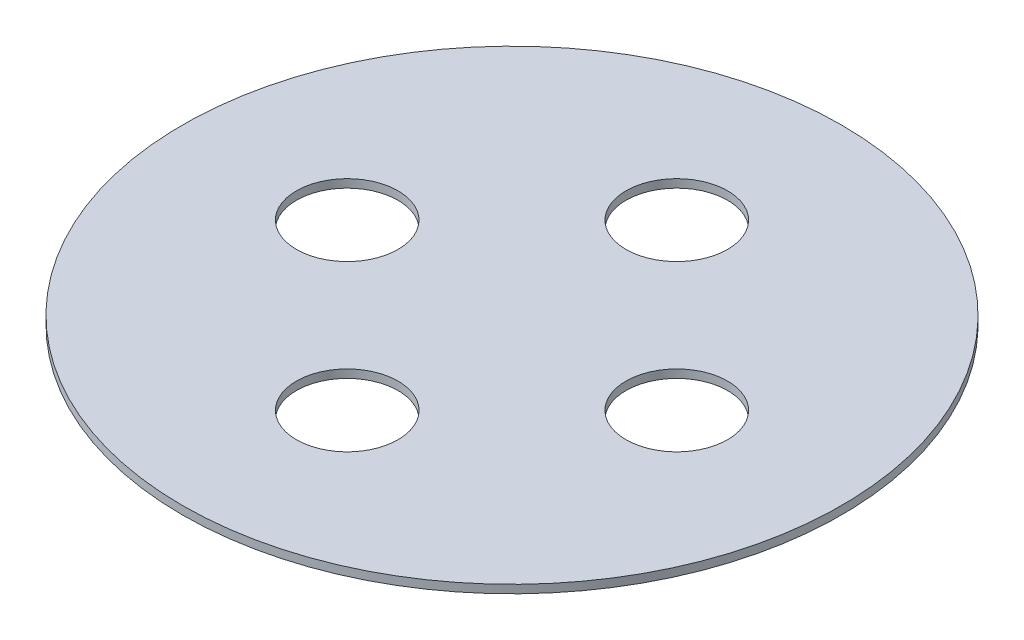
ISO-10303-21;
HEADER;
FILE_DESCRIPTION(('STEP AP214'),'2;1');
FILE_NAME('part.step','',(''),(''),'','','');
FILE_SCHEMA(('AUTOMOTIVE_DESIGN { 1 0 10303 214 1 1 1 1 }'));
ENDSEC;
DATA;
#1=APPLICATION_CONTEXT('core data for automotive mechanical design processes');
#2=APPLICATION_PROTOCOL_DEFINITION('international standard','automotive_design',2000,#1);
#3=PRODUCT_CONTEXT('',#1,'mechanical');
#4=PRODUCT('Part','Part','',(#3));
#5=PRODUCT_RELATED_PRODUCT_CATEGORY('part','',(#4));
#6=PRODUCT_DEFINITION_FORMATION('','',#4);
#7=PRODUCT_DEFINITION_CONTEXT('part definition',#1,'design');
#8=PRODUCT_DEFINITION('design','',#6,#7);
#9=PRODUCT_DEFINITION_SHAPE('','',#8);
#10=(LENGTH_UNIT() NAMED_UNIT(*) SI_UNIT(.MILLI.,.METRE.));
#11=(NAMED_UNIT(*) PLANE_ANGLE_UNIT() SI_UNIT($,.RADIAN.));
#12=(NAMED_UNIT(*) SI_UNIT($,.STERADIAN.) SOLID_ANGLE_UNIT());
#13=UNCERTAINTY_MEASURE_WITH_UNIT(LENGTH_MEASURE(1.E-05),#10,'distance_accuracy_value','');
#14=(GEOMETRIC_REPRESENTATION_CONTEXT(3) GLOBAL_UNCERTAINTY_ASSIGNED_CONTEXT((#13)) GLOBAL_UNIT_ASSIGNED_CONTEXT((#10,
#11,#12)) REPRESENTATION_CONTEXT('',''));
#15=CARTESIAN_POINT('',(0.,0.,0.));
#16=DIRECTION('',(0.,0.,1.));
#17=DIRECTION('',(1.,0.,0.));
#18=AXIS2_PLACEMENT_3D('',#15,#16,#17);
#19=CARTESIAN_POINT('',(6.,7.,0.));
#20=DIRECTION('',(0.,-1.,0.));
#21=DIRECTION('',(0.,0.,-1.));
#22=AXIS2_PLACEMENT_3D('',#19,#20,#21);
#23=CYLINDRICAL_SURFACE('',#22,1.85);
#24=CARTESIAN_POINT('',(6.,0.,0.));
#25=DIRECTION('',(0.,1.,0.));
#26=DIRECTION('',(0.,0.,1.));
#27=AXIS2_PLACEMENT_3D('',#24,#25,#26);
#28=CIRCLE('',#27,1.85);
#29=CARTESIAN_POINT('',(6.,0.,1.85));
#30=VERTEX_POINT('',#29);
#31=EDGE_CURVE('E11',#30,#30,#28,.T.);
#32=ORIENTED_EDGE('',*,*,#31,.F.);
#33=EDGE_LOOP('',(#32));
#34=FACE_BOUND('',#33,.T.);
#35=CARTESIAN_POINT('',(6.,0.3,0.));
#36=DIRECTION('',(0.,1.,0.));
#37=DIRECTION('',(0.,0.,1.));
#38=AXIS2_PLACEMENT_3D('',#35,#36,#37);
#39=CIRCLE('',#38,1.85);
#40=CARTESIAN_POINT('',(6.,0.3,1.85));
#41=VERTEX_POINT('',#40);
#42=EDGE_CURVE('E57',#41,#41,#39,.T.);
#43=ORIENTED_EDGE('',*,*,#42,.T.);
#44=EDGE_LOOP('',(#43));
#45=FACE_BOUND('',#44,.T.);
#46=ADVANCED_FACE('F37',(#34,#45),#23,.F.);
#47=CARTESIAN_POINT('',(0.,7.,6.));
#48=DIRECTION('',(0.,-1.,0.));
#49=DIRECTION('',(0.,0.,-1.));
#50=AXIS2_PLACEMENT_3D('',#47,#48,#49);
#51=CYLINDRICAL_SURFACE('',#50,1.85);
#52=CARTESIAN_POINT('',(0.,0.,6.));
#53=DIRECTION('',(0.,1.,0.));
#54=DIRECTION('',(0.,0.,1.));
#55=AXIS2_PLACEMENT_3D('',#52,#53,#54);
#56=CIRCLE('',#55,1.85);
#57=CARTESIAN_POINT('',(0.,0.,7.85));
#58=VERTEX_POINT('',#57);
#59=EDGE_CURVE('E45',#58,#58,#56,.T.);
#60=ORIENTED_EDGE('',*,*,#59,.F.);
#61=EDGE_LOOP('',(#60));
#62=FACE_BOUND('',#61,.T.);
#63=CARTESIAN_POINT('',(0.,0.3,6.));
#64=DIRECTION('',(0.,1.,0.));
#65=DIRECTION('',(0.,0.,1.));
#66=AXIS2_PLACEMENT_3D('',#63,#64,#65);
#67=CIRCLE('',#66,1.85);
#68=CARTESIAN_POINT('',(0.,0.3,7.85));
#69=VERTEX_POINT('',#68);
#70=EDGE_CURVE('E60',#69,#69,#67,.T.);
#71=ORIENTED_EDGE('',*,*,#70,.T.);
#72=EDGE_LOOP('',(#71));
#73=FACE_BOUND('',#72,.T.);
#74=ADVANCED_FACE('F96',(#62,#73),#51,.F.);
#75=CARTESIAN_POINT('',(-6.,7.,0.));
#76=DIRECTION('',(0.,-1.,0.));
#77=DIRECTION('',(0.,0.,-1.));
#78=AXIS2_PLACEMENT_3D('',#75,#76,#77);
#79=CYLINDRICAL_SURFACE('',#78,1.85);
#80=CARTESIAN_POINT('',(-6.,0.,0.));
#81=DIRECTION('',(0.,1.,0.));
#82=DIRECTION('',(0.,0.,1.));
#83=AXIS2_PLACEMENT_3D('',#80,#81,#82);
#84=CIRCLE('',#83,1.85);
#85=CARTESIAN_POINT('',(-6.,0.,1.85));
#86=VERTEX_POINT('',#85);
#87=EDGE_CURVE('E49',#86,#86,#84,.T.);
#88=ORIENTED_EDGE('',*,*,#87,.F.);
#89=EDGE_LOOP('',(#88));
#90=FACE_BOUND('',#89,.T.);
#91=CARTESIAN_POINT('',(-6.,0.3,0.));
#92=DIRECTION('',(0.,1.,0.));
#93=DIRECTION('',(0.,0.,1.));
#94=AXIS2_PLACEMENT_3D('',#91,#92,#93);
#95=CIRCLE('',#94,1.85);
#96=CARTESIAN_POINT('',(-6.,0.3,1.85));
#97=VERTEX_POINT('',#96);
#98=EDGE_CURVE('E63',#97,#97,#95,.T.);
#99=ORIENTED_EDGE('',*,*,#98,.T.);
#100=EDGE_LOOP('',(#99));
#101=FACE_BOUND('',#100,.T.);
#102=ADVANCED_FACE('F101',(#90,#101),#79,.F.);
#103=CARTESIAN_POINT('',(0.,7.,-6.));
#104=DIRECTION('',(0.,-1.,0.));
#105=DIRECTION('',(0.,0.,-1.));
#106=AXIS2_PLACEMENT_3D('',#103,#104,#105);
#107=CYLINDRICAL_SURFACE('',#106,1.85);
#108=CARTESIAN_POINT('',(0.,0.,-6.));
#109=DIRECTION('',(0.,1.,0.));
#110=DIRECTION('',(0.,0.,1.));
#111=AXIS2_PLACEMENT_3D('',#108,#109,#110);
#112=CIRCLE('',#111,1.85);
#113=CARTESIAN_POINT('',(0.,0.,-4.15));
#114=VERTEX_POINT('',#113);
#115=EDGE_CURVE('E54',#114,#114,#112,.T.);
#116=ORIENTED_EDGE('',*,*,#115,.F.);
#117=EDGE_LOOP('',(#116));
#118=FACE_BOUND('',#117,.T.);
#119=CARTESIAN_POINT('',(0.,0.3,-6.));
#120=DIRECTION('',(0.,1.,0.));
#121=DIRECTION('',(0.,0.,1.));
#122=AXIS2_PLACEMENT_3D('',#119,#120,#121);
#123=CIRCLE('',#122,1.85);
#124=CARTESIAN_POINT('',(0.,0.3,-4.15));
#125=VERTEX_POINT('',#124);
#126=EDGE_CURVE('E41',#125,#125,#123,.T.);
#127=ORIENTED_EDGE('',*,*,#126,.T.);
#128=EDGE_LOOP('',(#127));
#129=FACE_BOUND('',#128,.T.);
#130=ADVANCED_FACE('F76',(#118,#129),#107,.F.);
#131=CARTESIAN_POINT('',(0.,0.,0.));
#132=DIRECTION('',(0.,1.,0.));
#133=DIRECTION('',(0.,0.,1.));
#134=AXIS2_PLACEMENT_3D('',#131,#132,#133);
#135=PLANE('',#134);
#136=ORIENTED_EDGE('',*,*,#31,.T.);
#137=EDGE_LOOP('',(#136));
#138=FACE_BOUND('',#137,.T.);
#139=ORIENTED_EDGE('',*,*,#59,.T.);
#140=EDGE_LOOP('',(#139));
#141=FACE_BOUND('',#140,.T.);
#142=ORIENTED_EDGE('',*,*,#87,.T.);
#143=EDGE_LOOP('',(#142));
#144=FACE_BOUND('',#143,.T.);
#145=ORIENTED_EDGE('',*,*,#115,.T.);
#146=EDGE_LOOP('',(#145));
#147=FACE_BOUND('',#146,.T.);
#148=CARTESIAN_POINT('',(0.,0.,0.));
#149=DIRECTION('',(0.,1.,0.));
#150=DIRECTION('',(0.,0.,1.));
#151=AXIS2_PLACEMENT_3D('',#148,#149,#150);
#152=CIRCLE('',#151,12.);
#153=CARTESIAN_POINT('',(0.,0.,12.));
#154=VERTEX_POINT('',#153);
#155=EDGE_CURVE('E69',#154,#154,#152,.T.);
#156=ORIENTED_EDGE('',*,*,#155,.F.);
#157=EDGE_LOOP('',(#156));
#158=FACE_BOUND('',#157,.T.);
#159=ADVANCED_FACE('F39',(#138,#141,#144,#147,#158),#135,.F.);
#160=CARTESIAN_POINT('',(0.,0.3,0.));
#161=DIRECTION('',(0.,1.,0.));
#162=DIRECTION('',(0.,0.,1.));
#163=AXIS2_PLACEMENT_3D('',#160,#161,#162);
#164=PLANE('',#163);
#165=ORIENTED_EDGE('',*,*,#126,.F.);
#166=EDGE_LOOP('',(#165));
#167=FACE_BOUND('',#166,.T.);
#168=ORIENTED_EDGE('',*,*,#98,.F.);
#169=EDGE_LOOP('',(#168));
#170=FACE_BOUND('',#169,.T.);
#171=ORIENTED_EDGE('',*,*,#70,.F.);
#172=EDGE_LOOP('',(#171));
#173=FACE_BOUND('',#172,.T.);
#174=ORIENTED_EDGE('',*,*,#42,.F.);
#175=EDGE_LOOP('',(#174));
#176=FACE_BOUND('',#175,.T.);
#177=CARTESIAN_POINT('',(0.,0.3,0.));
#178=DIRECTION('',(0.,1.,0.));
#179=DIRECTION('',(0.,0.,1.));
#180=AXIS2_PLACEMENT_3D('',#177,#178,#179);
#181=CIRCLE('',#180,12.);
#182=CARTESIAN_POINT('',(0.,0.3,12.));
#183=VERTEX_POINT('',#182);
#184=EDGE_CURVE('E66',#183,#183,#181,.T.);
#185=ORIENTED_EDGE('',*,*,#184,.T.);
#186=EDGE_LOOP('',(#185));
#187=FACE_BOUND('',#186,.T.);
#188=ADVANCED_FACE('F78',(#167,#170,#173,#176,#187),#164,.T.);
#189=CARTESIAN_POINT('',(0.,0.,0.));
#190=DIRECTION('',(0.,1.,0.));
#191=DIRECTION('',(0.,0.,1.));
#192=AXIS2_PLACEMENT_3D('',#189,#190,#191);
#193=CYLINDRICAL_SURFACE('',#192,12.);
#194=ORIENTED_EDGE('',*,*,#155,.T.);
#195=EDGE_LOOP('',(#194));
#196=FACE_BOUND('',#195,.T.);
#197=ORIENTED_EDGE('',*,*,#184,.F.);
#198=EDGE_LOOP('',(#197));
#199=FACE_BOUND('',#198,.T.);
#200=ADVANCED_FACE('F81',(#196,#199),#193,.T.);
#201=CLOSED_SHELL('',(#46,#74,#102,#130,#159,#188,#200));
#202=MANIFOLD_SOLID_BREP('B2',#201);
#203=ADVANCED_BREP_SHAPE_REPRESENTATION('',(#18,#202),#14);
#204=SHAPE_DEFINITION_REPRESENTATION(#9,#203);
ENDSEC;
END-ISO-10303-21;
